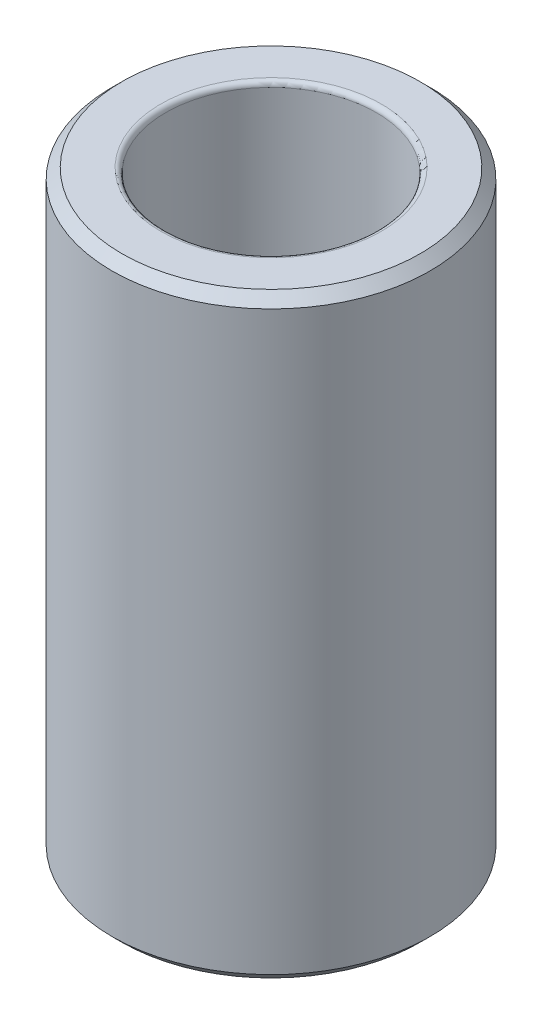
ISO-10303-21;
HEADER;
FILE_DESCRIPTION(('STEP AP214'),'2;1');
FILE_NAME('part.step','',(''),(''),'','','');
FILE_SCHEMA(('AUTOMOTIVE_DESIGN { 1 0 10303 214 1 1 1 1 }'));
ENDSEC;
DATA;
#1=APPLICATION_CONTEXT('core data for automotive mechanical design processes');
#2=APPLICATION_PROTOCOL_DEFINITION('international standard','automotive_design',2000,#1);
#3=PRODUCT_CONTEXT('',#1,'mechanical');
#4=PRODUCT('Part','Part','',(#3));
#5=PRODUCT_RELATED_PRODUCT_CATEGORY('part','',(#4));
#6=PRODUCT_DEFINITION_FORMATION('','',#4);
#7=PRODUCT_DEFINITION_CONTEXT('part definition',#1,'design');
#8=PRODUCT_DEFINITION('design','',#6,#7);
#9=PRODUCT_DEFINITION_SHAPE('','',#8);
#10=(LENGTH_UNIT() NAMED_UNIT(*) SI_UNIT(.MILLI.,.METRE.));
#11=(NAMED_UNIT(*) PLANE_ANGLE_UNIT() SI_UNIT($,.RADIAN.));
#12=(NAMED_UNIT(*) SI_UNIT($,.STERADIAN.) SOLID_ANGLE_UNIT());
#13=UNCERTAINTY_MEASURE_WITH_UNIT(LENGTH_MEASURE(1.E-05),#10,'distance_accuracy_value','');
#14=(GEOMETRIC_REPRESENTATION_CONTEXT(3) GLOBAL_UNCERTAINTY_ASSIGNED_CONTEXT((#13)) GLOBAL_UNIT_ASSIGNED_CONTEXT((#10,
#11,#12)) REPRESENTATION_CONTEXT('',''));
#15=CARTESIAN_POINT('',(0.,0.,0.));
#16=DIRECTION('',(0.,0.,1.));
#17=DIRECTION('',(1.,0.,0.));
#18=AXIS2_PLACEMENT_3D('',#15,#16,#17);
#19=CARTESIAN_POINT('',(0.,15.,0.));
#20=DIRECTION('',(0.,1.,0.));
#21=DIRECTION('',(0.,0.,1.));
#22=AXIS2_PLACEMENT_3D('',#19,#20,#21);
#23=PLANE('',#22);
#24=CARTESIAN_POINT('',(0.,15.,0.));
#25=DIRECTION('',(0.,1.,0.));
#26=DIRECTION('',(0.,0.,1.));
#27=AXIS2_PLACEMENT_3D('',#24,#25,#26);
#28=CIRCLE('',#27,2.775);
#29=CARTESIAN_POINT('',(0.,15.,2.775));
#30=VERTEX_POINT('',#29);
#31=EDGE_CURVE('E10',#30,#30,#28,.F.);
#32=ORIENTED_EDGE('',*,*,#31,.T.);
#33=EDGE_LOOP('',(#32));
#34=FACE_BOUND('',#33,.T.);
#35=CARTESIAN_POINT('',(0.,15.,0.));
#36=DIRECTION('',(0.,1.,0.));
#37=DIRECTION('',(0.,0.,1.));
#38=AXIS2_PLACEMENT_3D('',#35,#36,#37);
#39=CIRCLE('',#38,3.75);
#40=CARTESIAN_POINT('',(0.,15.,3.75));
#41=VERTEX_POINT('',#40);
#42=EDGE_CURVE('E69',#41,#41,#39,.T.);
#43=ORIENTED_EDGE('',*,*,#42,.T.);
#44=EDGE_LOOP('',(#43));
#45=FACE_BOUND('',#44,.T.);
#46=ADVANCED_FACE('F45',(#34,#45),#23,.T.);
#47=CARTESIAN_POINT('',(0.,0.,0.));
#48=DIRECTION('',(0.,1.,0.));
#49=DIRECTION('',(0.,0.,1.));
#50=AXIS2_PLACEMENT_3D('',#47,#48,#49);
#51=PLANE('',#50);
#52=CARTESIAN_POINT('',(0.,0.,0.));
#53=DIRECTION('',(0.,1.,0.));
#54=DIRECTION('',(0.,0.,1.));
#55=AXIS2_PLACEMENT_3D('',#52,#53,#54);
#56=CIRCLE('',#55,2.775);
#57=CARTESIAN_POINT('',(0.,0.,2.775));
#58=VERTEX_POINT('',#57);
#59=EDGE_CURVE('E63',#58,#58,#56,.T.);
#60=ORIENTED_EDGE('',*,*,#59,.T.);
#61=EDGE_LOOP('',(#60));
#62=FACE_BOUND('',#61,.T.);
#63=CARTESIAN_POINT('',(0.,0.,0.));
#64=DIRECTION('',(0.,1.,0.));
#65=DIRECTION('',(0.,0.,1.));
#66=AXIS2_PLACEMENT_3D('',#63,#64,#65);
#67=CIRCLE('',#66,3.75);
#68=CARTESIAN_POINT('',(0.,0.,3.75));
#69=VERTEX_POINT('',#68);
#70=EDGE_CURVE('E73',#69,#69,#67,.F.);
#71=ORIENTED_EDGE('',*,*,#70,.T.);
#72=EDGE_LOOP('',(#71));
#73=FACE_BOUND('',#72,.T.);
#74=ADVANCED_FACE('F97',(#62,#73),#51,.F.);
#75=CARTESIAN_POINT('',(0.,15.,0.));
#76=DIRECTION('',(0.,-1.,0.));
#77=DIRECTION('',(0.,0.,-1.));
#78=AXIS2_PLACEMENT_3D('',#75,#76,#77);
#79=CYLINDRICAL_SURFACE('',#78,4.);
#80=CARTESIAN_POINT('',(0.,0.250000000000002,0.));
#81=DIRECTION('',(0.,1.,0.));
#82=DIRECTION('',(0.,0.,1.));
#83=AXIS2_PLACEMENT_3D('',#80,#81,#82);
#84=CIRCLE('',#83,4.);
#85=CARTESIAN_POINT('',(0.,0.250000000000002,4.));
#86=VERTEX_POINT('',#85);
#87=EDGE_CURVE('E77',#86,#86,#84,.T.);
#88=ORIENTED_EDGE('',*,*,#87,.T.);
#89=EDGE_LOOP('',(#88));
#90=FACE_BOUND('',#89,.T.);
#91=CARTESIAN_POINT('',(0.,14.75,0.));
#92=DIRECTION('',(0.,1.,0.));
#93=DIRECTION('',(0.,0.,1.));
#94=AXIS2_PLACEMENT_3D('',#91,#92,#93);
#95=CIRCLE('',#94,4.);
#96=CARTESIAN_POINT('',(0.,14.75,4.));
#97=VERTEX_POINT('',#96);
#98=EDGE_CURVE('E81',#97,#97,#95,.F.);
#99=ORIENTED_EDGE('',*,*,#98,.T.);
#100=EDGE_LOOP('',(#99));
#101=FACE_BOUND('',#100,.T.);
#102=ADVANCED_FACE('F86',(#90,#101),#79,.T.);
#103=CARTESIAN_POINT('',(0.,15.,0.));
#104=DIRECTION('',(0.,-1.,0.));
#105=DIRECTION('',(0.,0.,-1.));
#106=AXIS2_PLACEMENT_3D('',#103,#104,#105);
#107=CYLINDRICAL_SURFACE('',#106,2.65);
#108=CARTESIAN_POINT('',(0.,0.125,0.));
#109=DIRECTION('',(0.,1.,0.));
#110=DIRECTION('',(0.,0.,1.));
#111=AXIS2_PLACEMENT_3D('',#108,#109,#110);
#112=CIRCLE('',#111,2.65);
#113=CARTESIAN_POINT('',(0.,0.125,2.65));
#114=VERTEX_POINT('',#113);
#115=EDGE_CURVE('E53',#114,#114,#112,.F.);
#116=ORIENTED_EDGE('',*,*,#115,.T.);
#117=EDGE_LOOP('',(#116));
#118=FACE_BOUND('',#117,.T.);
#119=CARTESIAN_POINT('',(0.,14.875,0.));
#120=DIRECTION('',(0.,1.,0.));
#121=DIRECTION('',(0.,0.,1.));
#122=AXIS2_PLACEMENT_3D('',#119,#120,#121);
#123=CIRCLE('',#122,2.65);
#124=CARTESIAN_POINT('',(0.,14.875,2.65));
#125=VERTEX_POINT('',#124);
#126=EDGE_CURVE('E58',#125,#125,#123,.T.);
#127=ORIENTED_EDGE('',*,*,#126,.T.);
#128=EDGE_LOOP('',(#127));
#129=FACE_BOUND('',#128,.T.);
#130=ADVANCED_FACE('F105',(#118,#129),#107,.F.);
#131=CARTESIAN_POINT('',(0.,0.250000000000002,0.));
#132=DIRECTION('',(0.,1.,0.));
#133=DIRECTION('',(0.,0.,1.));
#134=AXIS2_PLACEMENT_3D('',#131,#132,#133);
#135=CONICAL_SURFACE('',#134,4.,0.785398163397448);
#136=ORIENTED_EDGE('',*,*,#70,.F.);
#137=EDGE_LOOP('',(#136));
#138=FACE_BOUND('',#137,.T.);
#139=ORIENTED_EDGE('',*,*,#87,.F.);
#140=EDGE_LOOP('',(#139));
#141=FACE_BOUND('',#140,.T.);
#142=ADVANCED_FACE('F92',(#138,#141),#135,.T.);
#143=CARTESIAN_POINT('',(0.,15.,0.));
#144=DIRECTION('',(0.,-1.,0.));
#145=DIRECTION('',(0.,0.,-1.));
#146=AXIS2_PLACEMENT_3D('',#143,#144,#145);
#147=CONICAL_SURFACE('',#146,3.75,0.785398163397445);
#148=ORIENTED_EDGE('',*,*,#98,.F.);
#149=EDGE_LOOP('',(#148));
#150=FACE_BOUND('',#149,.T.);
#151=ORIENTED_EDGE('',*,*,#42,.F.);
#152=EDGE_LOOP('',(#151));
#153=FACE_BOUND('',#152,.T.);
#154=ADVANCED_FACE('F88',(#150,#153),#147,.T.);
#155=CARTESIAN_POINT('',(0.,0.125,0.));
#156=DIRECTION('',(0.,1.,0.));
#157=DIRECTION('',(0.,0.,1.));
#158=AXIS2_PLACEMENT_3D('',#155,#156,#157);
#159=TOROIDAL_SURFACE('',#158,2.775,0.125);
#160=ORIENTED_EDGE('',*,*,#115,.F.);
#161=EDGE_LOOP('',(#160));
#162=FACE_BOUND('',#161,.T.);
#163=ORIENTED_EDGE('',*,*,#59,.F.);
#164=EDGE_LOOP('',(#163));
#165=FACE_BOUND('',#164,.T.);
#166=ADVANCED_FACE('F91',(#162,#165),#159,.T.);
#167=CARTESIAN_POINT('',(0.,14.875,0.));
#168=DIRECTION('',(0.,1.,0.));
#169=DIRECTION('',(0.,0.,1.));
#170=AXIS2_PLACEMENT_3D('',#167,#168,#169);
#171=TOROIDAL_SURFACE('',#170,2.775,0.125);
#172=ORIENTED_EDGE('',*,*,#31,.F.);
#173=EDGE_LOOP('',(#172));
#174=FACE_BOUND('',#173,.T.);
#175=ORIENTED_EDGE('',*,*,#126,.F.);
#176=EDGE_LOOP('',(#175));
#177=FACE_BOUND('',#176,.T.);
#178=ADVANCED_FACE('F47',(#174,#177),#171,.T.);
#179=CLOSED_SHELL('',(#46,#74,#102,#130,#142,#154,#166,#178));
#180=MANIFOLD_SOLID_BREP('B2',#179);
#181=ADVANCED_BREP_SHAPE_REPRESENTATION('',(#18,#180),#14);
#182=SHAPE_DEFINITION_REPRESENTATION(#9,#181);
ENDSEC;
END-ISO-10303-21;
